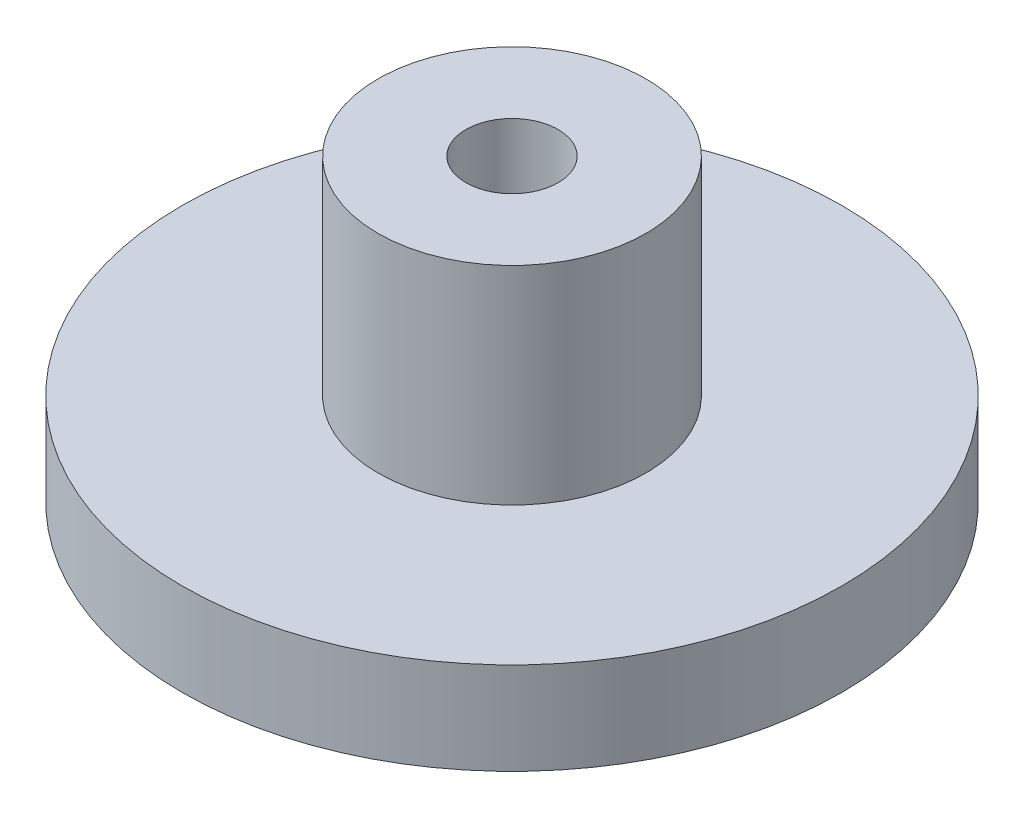
ISO-10303-21;
HEADER;
FILE_DESCRIPTION(('STEP AP214'),'2;1');
FILE_NAME('part.step','',(''),(''),'','','');
FILE_SCHEMA(('AUTOMOTIVE_DESIGN { 1 0 10303 214 1 1 1 1 }'));
ENDSEC;
DATA;
#1=APPLICATION_CONTEXT('core data for automotive mechanical design processes');
#2=APPLICATION_PROTOCOL_DEFINITION('international standard','automotive_design',2000,#1);
#3=PRODUCT_CONTEXT('',#1,'mechanical');
#4=PRODUCT('Part','Part','',(#3));
#5=PRODUCT_RELATED_PRODUCT_CATEGORY('part','',(#4));
#6=PRODUCT_DEFINITION_FORMATION('','',#4);
#7=PRODUCT_DEFINITION_CONTEXT('part definition',#1,'design');
#8=PRODUCT_DEFINITION('design','',#6,#7);
#9=PRODUCT_DEFINITION_SHAPE('','',#8);
#10=(LENGTH_UNIT() NAMED_UNIT(*) SI_UNIT(.MILLI.,.METRE.));
#11=(NAMED_UNIT(*) PLANE_ANGLE_UNIT() SI_UNIT($,.RADIAN.));
#12=(NAMED_UNIT(*) SI_UNIT($,.STERADIAN.) SOLID_ANGLE_UNIT());
#13=UNCERTAINTY_MEASURE_WITH_UNIT(LENGTH_MEASURE(1.E-05),#10,'distance_accuracy_value','');
#14=(GEOMETRIC_REPRESENTATION_CONTEXT(3) GLOBAL_UNCERTAINTY_ASSIGNED_CONTEXT((#13)) GLOBAL_UNIT_ASSIGNED_CONTEXT((#10,
#11,#12)) REPRESENTATION_CONTEXT('',''));
#15=CARTESIAN_POINT('',(0.,0.,0.));
#16=DIRECTION('',(0.,0.,1.));
#17=DIRECTION('',(1.,0.,0.));
#18=AXIS2_PLACEMENT_3D('',#15,#16,#17);
#19=CARTESIAN_POINT('',(2.905125,6.5,0.));
#20=DIRECTION('',(0.,1.,0.));
#21=DIRECTION('',(0.,0.,-1.));
#22=AXIS2_PLACEMENT_3D('',#19,#20,#21);
#23=PLANE('',#22);
#24=CARTESIAN_POINT('',(0.,6.5,0.));
#25=DIRECTION('',(0.,1.,0.));
#26=DIRECTION('',(0.,0.,1.));
#27=AXIS2_PLACEMENT_3D('',#24,#25,#26);
#28=CIRCLE('',#27,1.);
#29=CARTESIAN_POINT('',(0.,6.5,1.));
#30=VERTEX_POINT('',#29);
#31=EDGE_CURVE('E10',#30,#30,#28,.T.);
#32=ORIENTED_EDGE('',*,*,#31,.F.);
#33=EDGE_LOOP('',(#32));
#34=FACE_BOUND('',#33,.T.);
#35=CARTESIAN_POINT('',(0.,6.5,0.));
#36=DIRECTION('',(0.,1.,0.));
#37=DIRECTION('',(0.,0.,1.));
#38=AXIS2_PLACEMENT_3D('',#35,#36,#37);
#39=CIRCLE('',#38,2.905125);
#40=CARTESIAN_POINT('',(0.,6.5,2.905125));
#41=VERTEX_POINT('',#40);
#42=EDGE_CURVE('E69',#41,#41,#39,.T.);
#43=ORIENTED_EDGE('',*,*,#42,.T.);
#44=EDGE_LOOP('',(#43));
#45=FACE_BOUND('',#44,.T.);
#46=ADVANCED_FACE('F35',(#34,#45),#23,.T.);
#47=CARTESIAN_POINT('',(0.,0.,0.));
#48=DIRECTION('',(0.,-1.,0.));
#49=DIRECTION('',(0.,0.,1.));
#50=AXIS2_PLACEMENT_3D('',#47,#48,#49);
#51=CYLINDRICAL_SURFACE('',#50,1.);
#52=CARTESIAN_POINT('',(0.,0.,0.));
#53=DIRECTION('',(0.,1.,0.));
#54=DIRECTION('',(0.,0.,1.));
#55=AXIS2_PLACEMENT_3D('',#52,#53,#54);
#56=CIRCLE('',#55,1.);
#57=CARTESIAN_POINT('',(0.,0.,1.));
#58=VERTEX_POINT('',#57);
#59=EDGE_CURVE('E41',#58,#58,#56,.T.);
#60=ORIENTED_EDGE('',*,*,#59,.F.);
#61=EDGE_LOOP('',(#60));
#62=FACE_BOUND('',#61,.T.);
#63=ORIENTED_EDGE('',*,*,#31,.T.);
#64=EDGE_LOOP('',(#63));
#65=FACE_BOUND('',#64,.T.);
#66=ADVANCED_FACE('F118',(#62,#65),#51,.F.);
#67=CARTESIAN_POINT('',(1.,0.,0.));
#68=DIRECTION('',(0.,-1.,0.));
#69=DIRECTION('',(0.,0.,1.));
#70=AXIS2_PLACEMENT_3D('',#67,#68,#69);
#71=PLANE('',#70);
#72=CARTESIAN_POINT('',(0.,0.,0.));
#73=DIRECTION('',(0.,1.,0.));
#74=DIRECTION('',(0.,0.,1.));
#75=AXIS2_PLACEMENT_3D('',#72,#73,#74);
#76=CIRCLE('',#75,2.5);
#77=CARTESIAN_POINT('',(0.,0.,2.5));
#78=VERTEX_POINT('',#77);
#79=EDGE_CURVE('E45',#78,#78,#76,.T.);
#80=ORIENTED_EDGE('',*,*,#79,.F.);
#81=EDGE_LOOP('',(#80));
#82=FACE_BOUND('',#81,.T.);
#83=ORIENTED_EDGE('',*,*,#59,.T.);
#84=EDGE_LOOP('',(#83));
#85=FACE_BOUND('',#84,.T.);
#86=ADVANCED_FACE('F113',(#82,#85),#71,.T.);
#87=CARTESIAN_POINT('',(0.,0.,0.));
#88=DIRECTION('',(0.,-1.,0.));
#89=DIRECTION('',(0.,0.,1.));
#90=AXIS2_PLACEMENT_3D('',#87,#88,#89);
#91=CYLINDRICAL_SURFACE('',#90,2.5);
#92=CARTESIAN_POINT('',(0.,0.6,0.));
#93=DIRECTION('',(0.,1.,0.));
#94=DIRECTION('',(0.,0.,1.));
#95=AXIS2_PLACEMENT_3D('',#92,#93,#94);
#96=CIRCLE('',#95,2.5);
#97=CARTESIAN_POINT('',(0.,0.6,2.5));
#98=VERTEX_POINT('',#97);
#99=EDGE_CURVE('E49',#98,#98,#96,.T.);
#100=ORIENTED_EDGE('',*,*,#99,.F.);
#101=EDGE_LOOP('',(#100));
#102=FACE_BOUND('',#101,.T.);
#103=ORIENTED_EDGE('',*,*,#79,.T.);
#104=EDGE_LOOP('',(#103));
#105=FACE_BOUND('',#104,.T.);
#106=ADVANCED_FACE('F107',(#102,#105),#91,.T.);
#107=CARTESIAN_POINT('',(2.5,0.6,0.));
#108=DIRECTION('',(0.,-1.,0.));
#109=DIRECTION('',(0.,0.,1.));
#110=AXIS2_PLACEMENT_3D('',#107,#108,#109);
#111=PLANE('',#110);
#112=CARTESIAN_POINT('',(0.,0.6,0.));
#113=DIRECTION('',(0.,1.,0.));
#114=DIRECTION('',(0.,0.,1.));
#115=AXIS2_PLACEMENT_3D('',#112,#113,#114);
#116=CIRCLE('',#115,5.5);
#117=CARTESIAN_POINT('',(0.,0.6,5.5));
#118=VERTEX_POINT('',#117);
#119=EDGE_CURVE('E54',#118,#118,#116,.T.);
#120=ORIENTED_EDGE('',*,*,#119,.F.);
#121=EDGE_LOOP('',(#120));
#122=FACE_BOUND('',#121,.T.);
#123=ORIENTED_EDGE('',*,*,#99,.T.);
#124=EDGE_LOOP('',(#123));
#125=FACE_BOUND('',#124,.T.);
#126=ADVANCED_FACE('F101',(#122,#125),#111,.T.);
#127=CARTESIAN_POINT('',(0.,0.,0.));
#128=DIRECTION('',(0.,-1.,0.));
#129=DIRECTION('',(0.,0.,1.));
#130=AXIS2_PLACEMENT_3D('',#127,#128,#129);
#131=CYLINDRICAL_SURFACE('',#130,5.5);
#132=CARTESIAN_POINT('',(0.,0.,0.));
#133=DIRECTION('',(0.,1.,0.));
#134=DIRECTION('',(0.,0.,1.));
#135=AXIS2_PLACEMENT_3D('',#132,#133,#134);
#136=CIRCLE('',#135,5.5);
#137=CARTESIAN_POINT('',(0.,0.,5.5));
#138=VERTEX_POINT('',#137);
#139=EDGE_CURVE('E57',#138,#138,#136,.T.);
#140=ORIENTED_EDGE('',*,*,#139,.F.);
#141=EDGE_LOOP('',(#140));
#142=FACE_BOUND('',#141,.T.);
#143=ORIENTED_EDGE('',*,*,#119,.T.);
#144=EDGE_LOOP('',(#143));
#145=FACE_BOUND('',#144,.T.);
#146=ADVANCED_FACE('F95',(#142,#145),#131,.F.);
#147=CARTESIAN_POINT('',(5.5,0.,0.));
#148=DIRECTION('',(0.,-1.,0.));
#149=DIRECTION('',(0.,0.,1.));
#150=AXIS2_PLACEMENT_3D('',#147,#148,#149);
#151=PLANE('',#150);
#152=CARTESIAN_POINT('',(0.,0.,0.));
#153=DIRECTION('',(0.,1.,0.));
#154=DIRECTION('',(0.,0.,1.));
#155=AXIS2_PLACEMENT_3D('',#152,#153,#154);
#156=CIRCLE('',#155,7.1501);
#157=CARTESIAN_POINT('',(0.,0.,7.1501));
#158=VERTEX_POINT('',#157);
#159=EDGE_CURVE('E60',#158,#158,#156,.T.);
#160=ORIENTED_EDGE('',*,*,#159,.F.);
#161=EDGE_LOOP('',(#160));
#162=FACE_BOUND('',#161,.T.);
#163=ORIENTED_EDGE('',*,*,#139,.T.);
#164=EDGE_LOOP('',(#163));
#165=FACE_BOUND('',#164,.T.);
#166=ADVANCED_FACE('F89',(#162,#165),#151,.T.);
#167=CARTESIAN_POINT('',(0.,0.,0.));
#168=DIRECTION('',(0.,-1.,0.));
#169=DIRECTION('',(0.,0.,1.));
#170=AXIS2_PLACEMENT_3D('',#167,#168,#169);
#171=CYLINDRICAL_SURFACE('',#170,7.1501);
#172=CARTESIAN_POINT('',(0.,2.,0.));
#173=DIRECTION('',(0.,1.,0.));
#174=DIRECTION('',(0.,0.,1.));
#175=AXIS2_PLACEMENT_3D('',#172,#173,#174);
#176=CIRCLE('',#175,7.1501);
#177=CARTESIAN_POINT('',(0.,2.,7.1501));
#178=VERTEX_POINT('',#177);
#179=EDGE_CURVE('E63',#178,#178,#176,.T.);
#180=ORIENTED_EDGE('',*,*,#179,.F.);
#181=EDGE_LOOP('',(#180));
#182=FACE_BOUND('',#181,.T.);
#183=ORIENTED_EDGE('',*,*,#159,.T.);
#184=EDGE_LOOP('',(#183));
#185=FACE_BOUND('',#184,.T.);
#186=ADVANCED_FACE('F83',(#182,#185),#171,.T.);
#187=CARTESIAN_POINT('',(7.1501,2.,0.));
#188=DIRECTION('',(0.,1.,0.));
#189=DIRECTION('',(0.,0.,-1.));
#190=AXIS2_PLACEMENT_3D('',#187,#188,#189);
#191=PLANE('',#190);
#192=CARTESIAN_POINT('',(0.,2.,0.));
#193=DIRECTION('',(0.,1.,0.));
#194=DIRECTION('',(0.,0.,1.));
#195=AXIS2_PLACEMENT_3D('',#192,#193,#194);
#196=CIRCLE('',#195,2.905125);
#197=CARTESIAN_POINT('',(0.,2.,2.905125));
#198=VERTEX_POINT('',#197);
#199=EDGE_CURVE('E66',#198,#198,#196,.T.);
#200=ORIENTED_EDGE('',*,*,#199,.F.);
#201=EDGE_LOOP('',(#200));
#202=FACE_BOUND('',#201,.T.);
#203=ORIENTED_EDGE('',*,*,#179,.T.);
#204=EDGE_LOOP('',(#203));
#205=FACE_BOUND('',#204,.T.);
#206=ADVANCED_FACE('F77',(#202,#205),#191,.T.);
#207=CARTESIAN_POINT('',(0.,0.,0.));
#208=DIRECTION('',(0.,-1.,0.));
#209=DIRECTION('',(0.,0.,1.));
#210=AXIS2_PLACEMENT_3D('',#207,#208,#209);
#211=CYLINDRICAL_SURFACE('',#210,2.905125);
#212=ORIENTED_EDGE('',*,*,#42,.F.);
#213=EDGE_LOOP('',(#212));
#214=FACE_BOUND('',#213,.T.);
#215=ORIENTED_EDGE('',*,*,#199,.T.);
#216=EDGE_LOOP('',(#215));
#217=FACE_BOUND('',#216,.T.);
#218=ADVANCED_FACE('F74',(#214,#217),#211,.T.);
#219=CLOSED_SHELL('',(#46,#66,#86,#106,#126,#146,#166,#186,#206,#218));
#220=MANIFOLD_SOLID_BREP('B2',#219);
#221=ADVANCED_BREP_SHAPE_REPRESENTATION('',(#18,#220),#14);
#222=SHAPE_DEFINITION_REPRESENTATION(#9,#221);
ENDSEC;
END-ISO-10303-21;
